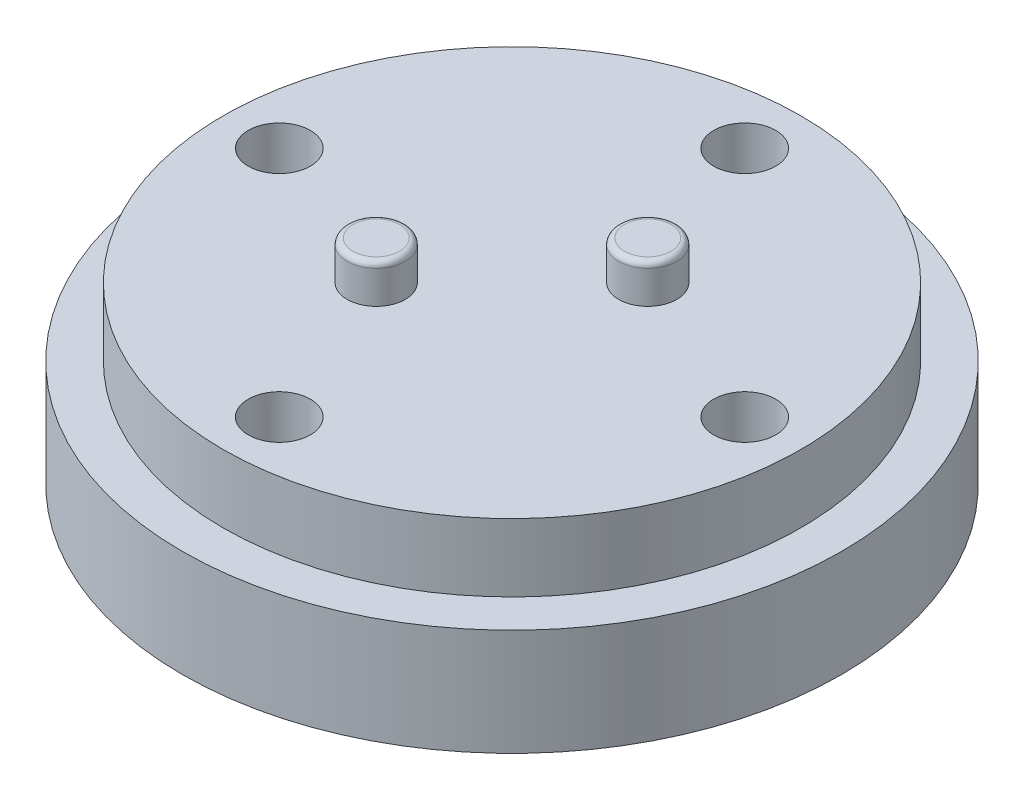
ISO-10303-21;
HEADER;
FILE_DESCRIPTION(('STEP AP214'),'2;1');
FILE_NAME('part.step','',(''),(''),'','','');
FILE_SCHEMA(('AUTOMOTIVE_DESIGN { 1 0 10303 214 1 1 1 1 }'));
ENDSEC;
DATA;
#1=APPLICATION_CONTEXT('core data for automotive mechanical design processes');
#2=APPLICATION_PROTOCOL_DEFINITION('international standard','automotive_design',2000,#1);
#3=PRODUCT_CONTEXT('',#1,'mechanical');
#4=PRODUCT('Part','Part','',(#3));
#5=PRODUCT_RELATED_PRODUCT_CATEGORY('part','',(#4));
#6=PRODUCT_DEFINITION_FORMATION('','',#4);
#7=PRODUCT_DEFINITION_CONTEXT('part definition',#1,'design');
#8=PRODUCT_DEFINITION('design','',#6,#7);
#9=PRODUCT_DEFINITION_SHAPE('','',#8);
#10=(LENGTH_UNIT() NAMED_UNIT(*) SI_UNIT(.MILLI.,.METRE.));
#11=(NAMED_UNIT(*) PLANE_ANGLE_UNIT() SI_UNIT($,.RADIAN.));
#12=(NAMED_UNIT(*) SI_UNIT($,.STERADIAN.) SOLID_ANGLE_UNIT());
#13=UNCERTAINTY_MEASURE_WITH_UNIT(LENGTH_MEASURE(1.E-05),#10,'distance_accuracy_value','');
#14=(GEOMETRIC_REPRESENTATION_CONTEXT(3) GLOBAL_UNCERTAINTY_ASSIGNED_CONTEXT((#13)) GLOBAL_UNIT_ASSIGNED_CONTEXT((#10,
#11,#12)) REPRESENTATION_CONTEXT('',''));
#15=CARTESIAN_POINT('',(0.,0.,0.));
#16=DIRECTION('',(0.,0.,1.));
#17=DIRECTION('',(1.,0.,0.));
#18=AXIS2_PLACEMENT_3D('',#15,#16,#17);
#19=CARTESIAN_POINT('',(0.,-5.5,0.));
#20=DIRECTION('',(0.,-1.,0.));
#21=DIRECTION('',(0.,0.,-1.));
#22=AXIS2_PLACEMENT_3D('',#19,#20,#21);
#23=PLANE('',#22);
#24=CARTESIAN_POINT('',(12.,-5.5,0.));
#25=DIRECTION('',(0.,-1.,0.));
#26=DIRECTION('',(0.,0.,-1.));
#27=AXIS2_PLACEMENT_3D('',#24,#25,#26);
#28=CIRCLE('',#27,1.6);
#29=CARTESIAN_POINT('',(12.,-5.5,-1.6));
#30=VERTEX_POINT('',#29);
#31=EDGE_CURVE('E205',#30,#30,#28,.T.);
#32=ORIENTED_EDGE('',*,*,#31,.F.);
#33=EDGE_LOOP('',(#32));
#34=FACE_BOUND('',#33,.T.);
#35=CARTESIAN_POINT('',(-12.,-5.5,0.));
#36=DIRECTION('',(0.,-1.,0.));
#37=DIRECTION('',(0.,0.,-1.));
#38=AXIS2_PLACEMENT_3D('',#35,#36,#37);
#39=CIRCLE('',#38,1.6);
#40=CARTESIAN_POINT('',(-12.,-5.5,-1.6));
#41=VERTEX_POINT('',#40);
#42=EDGE_CURVE('E213',#41,#41,#39,.T.);
#43=ORIENTED_EDGE('',*,*,#42,.F.);
#44=EDGE_LOOP('',(#43));
#45=FACE_BOUND('',#44,.T.);
#46=CARTESIAN_POINT('',(0.,-5.5,0.));
#47=DIRECTION('',(0.,-1.,0.));
#48=DIRECTION('',(0.,0.,-1.));
#49=AXIS2_PLACEMENT_3D('',#46,#47,#48);
#50=CIRCLE('',#49,17.);
#51=CARTESIAN_POINT('',(0.,-5.5,-17.));
#52=VERTEX_POINT('',#51);
#53=EDGE_CURVE('E218',#52,#52,#50,.T.);
#54=ORIENTED_EDGE('',*,*,#53,.T.);
#55=EDGE_LOOP('',(#54));
#56=FACE_BOUND('',#55,.T.);
#57=CARTESIAN_POINT('',(0.,-5.5,-12.));
#58=DIRECTION('',(0.,-1.,0.));
#59=DIRECTION('',(0.,0.,-1.));
#60=AXIS2_PLACEMENT_3D('',#57,#58,#59);
#61=CIRCLE('',#60,1.6);
#62=CARTESIAN_POINT('',(0.,-5.5,-13.6));
#63=VERTEX_POINT('',#62);
#64=EDGE_CURVE('E209',#63,#63,#61,.T.);
#65=ORIENTED_EDGE('',*,*,#64,.F.);
#66=EDGE_LOOP('',(#65));
#67=FACE_BOUND('',#66,.T.);
#68=CARTESIAN_POINT('',(0.,-5.5,12.));
#69=DIRECTION('',(0.,-1.,0.));
#70=DIRECTION('',(0.,0.,-1.));
#71=AXIS2_PLACEMENT_3D('',#68,#69,#70);
#72=CIRCLE('',#71,1.6);
#73=CARTESIAN_POINT('',(0.,-5.5,10.4));
#74=VERTEX_POINT('',#73);
#75=EDGE_CURVE('E143',#74,#74,#72,.T.);
#76=ORIENTED_EDGE('',*,*,#75,.F.);
#77=EDGE_LOOP('',(#76));
#78=FACE_BOUND('',#77,.T.);
#79=DIRECTION('',(-0.707106781186547,0.,0.707106781186547));
#80=VECTOR('',#79,1.);
#81=CARTESIAN_POINT('',(1.41421356237311,-5.5,4.10121933088196));
#82=LINE('',#81,#80);
#83=CARTESIAN_POINT('',(4.10121933088197,-5.5,1.4142135623731));
#84=VERTEX_POINT('',#83);
#85=CARTESIAN_POINT('',(1.41421356237311,-5.5,4.10121933088196));
#86=VERTEX_POINT('',#85);
#87=EDGE_CURVE('E138',#84,#86,#82,.T.);
#88=ORIENTED_EDGE('',*,*,#87,.F.);
#89=CARTESIAN_POINT('',(2.68700576850888,-5.5,0.));
#90=DIRECTION('',(0.,-1.,0.));
#91=DIRECTION('',(0.,0.,-1.));
#92=AXIS2_PLACEMENT_3D('',#89,#90,#91);
#93=CIRCLE('',#92,2.);
#94=CARTESIAN_POINT('',(4.10121933088197,-5.5,-1.41421356237311));
#95=VERTEX_POINT('',#94);
#96=EDGE_CURVE('E147',#95,#84,#93,.T.);
#97=ORIENTED_EDGE('',*,*,#96,.F.);
#98=DIRECTION('',(0.707106781186548,0.,0.707106781186547));
#99=VECTOR('',#98,1.);
#100=CARTESIAN_POINT('',(1.41421356237311,-5.5,-4.10121933088197));
#101=LINE('',#100,#99);
#102=CARTESIAN_POINT('',(1.41421356237311,-5.5,-4.10121933088197));
#103=VERTEX_POINT('',#102);
#104=EDGE_CURVE('E180',#103,#95,#101,.T.);
#105=ORIENTED_EDGE('',*,*,#104,.F.);
#106=CARTESIAN_POINT('',(0.,-5.5,-2.68700576850888));
#107=DIRECTION('',(0.,-1.,0.));
#108=DIRECTION('',(0.,0.,-1.));
#109=AXIS2_PLACEMENT_3D('',#106,#107,#108);
#110=CIRCLE('',#109,2.);
#111=CARTESIAN_POINT('',(-1.4142135623731,-5.5,-4.10121933088197));
#112=VERTEX_POINT('',#111);
#113=EDGE_CURVE('E176',#112,#103,#110,.T.);
#114=ORIENTED_EDGE('',*,*,#113,.F.);
#115=DIRECTION('',(0.707106781186547,0.,-0.707106781186548));
#116=VECTOR('',#115,1.);
#117=CARTESIAN_POINT('',(-4.10121933088196,-5.5,-1.41421356237311));
#118=LINE('',#117,#116);
#119=CARTESIAN_POINT('',(-4.10121933088196,-5.5,-1.41421356237311));
#120=VERTEX_POINT('',#119);
#121=EDGE_CURVE('E172',#120,#112,#118,.T.);
#122=ORIENTED_EDGE('',*,*,#121,.F.);
#123=CARTESIAN_POINT('',(-2.68700576850888,-5.5,0.));
#124=DIRECTION('',(0.,-1.,0.));
#125=DIRECTION('',(0.,0.,-1.));
#126=AXIS2_PLACEMENT_3D('',#123,#124,#125);
#127=CIRCLE('',#126,2.);
#128=CARTESIAN_POINT('',(-4.10121933088196,-5.5,1.4142135623731));
#129=VERTEX_POINT('',#128);
#130=EDGE_CURVE('E168',#129,#120,#127,.T.);
#131=ORIENTED_EDGE('',*,*,#130,.F.);
#132=DIRECTION('',(-0.707106781186548,0.,-0.707106781186548));
#133=VECTOR('',#132,1.);
#134=CARTESIAN_POINT('',(-4.10121933088196,-5.5,1.4142135623731));
#135=LINE('',#134,#133);
#136=CARTESIAN_POINT('',(-1.4142135623731,-5.5,4.10121933088196));
#137=VERTEX_POINT('',#136);
#138=EDGE_CURVE('E162',#137,#129,#135,.T.);
#139=ORIENTED_EDGE('',*,*,#138,.F.);
#140=CARTESIAN_POINT('',(0.,-5.5,2.68700576850888));
#141=DIRECTION('',(0.,-1.,0.));
#142=DIRECTION('',(0.,0.,1.));
#143=AXIS2_PLACEMENT_3D('',#140,#141,#142);
#144=CIRCLE('',#143,2.);
#145=EDGE_CURVE('E158',#86,#137,#144,.T.);
#146=ORIENTED_EDGE('',*,*,#145,.F.);
#147=EDGE_LOOP('',(#88,#97,#105,#114,#122,#131,#139,#146));
#148=FACE_BOUND('',#147,.T.);
#149=ADVANCED_FACE('F45',(#34,#45,#56,#67,#78,#148),#23,.T.);
#150=CARTESIAN_POINT('',(0.,3.5,12.));
#151=DIRECTION('',(0.,-1.,0.));
#152=DIRECTION('',(0.,0.,-1.));
#153=AXIS2_PLACEMENT_3D('',#150,#151,#152);
#154=CYLINDRICAL_SURFACE('',#153,1.6);
#155=CARTESIAN_POINT('',(0.,3.5,12.));
#156=DIRECTION('',(0.,1.,0.));
#157=DIRECTION('',(0.,0.,1.));
#158=AXIS2_PLACEMENT_3D('',#155,#156,#157);
#159=CIRCLE('',#158,1.6);
#160=CARTESIAN_POINT('',(0.,3.5,13.6));
#161=VERTEX_POINT('',#160);
#162=EDGE_CURVE('E246',#161,#161,#159,.T.);
#163=ORIENTED_EDGE('',*,*,#162,.T.);
#164=EDGE_LOOP('',(#163));
#165=FACE_BOUND('',#164,.T.);
#166=ORIENTED_EDGE('',*,*,#75,.T.);
#167=EDGE_LOOP('',(#166));
#168=FACE_BOUND('',#167,.T.);
#169=ADVANCED_FACE('F406',(#165,#168),#154,.F.);
#170=CARTESIAN_POINT('',(-12.,3.5,0.));
#171=DIRECTION('',(0.,-1.,0.));
#172=DIRECTION('',(0.,0.,-1.));
#173=AXIS2_PLACEMENT_3D('',#170,#171,#172);
#174=CYLINDRICAL_SURFACE('',#173,1.6);
#175=CARTESIAN_POINT('',(-12.,3.5,0.));
#176=DIRECTION('',(0.,1.,0.));
#177=DIRECTION('',(0.,0.,1.));
#178=AXIS2_PLACEMENT_3D('',#175,#176,#177);
#179=CIRCLE('',#178,1.6);
#180=CARTESIAN_POINT('',(-12.,3.5,1.6));
#181=VERTEX_POINT('',#180);
#182=EDGE_CURVE('E242',#181,#181,#179,.T.);
#183=ORIENTED_EDGE('',*,*,#182,.T.);
#184=EDGE_LOOP('',(#183));
#185=FACE_BOUND('',#184,.T.);
#186=ORIENTED_EDGE('',*,*,#42,.T.);
#187=EDGE_LOOP('',(#186));
#188=FACE_BOUND('',#187,.T.);
#189=ADVANCED_FACE('F412',(#185,#188),#174,.F.);
#190=CARTESIAN_POINT('',(0.,3.5,-12.));
#191=DIRECTION('',(0.,-1.,0.));
#192=DIRECTION('',(0.,0.,-1.));
#193=AXIS2_PLACEMENT_3D('',#190,#191,#192);
#194=CYLINDRICAL_SURFACE('',#193,1.6);
#195=CARTESIAN_POINT('',(0.,3.5,-12.));
#196=DIRECTION('',(0.,1.,0.));
#197=DIRECTION('',(0.,0.,1.));
#198=AXIS2_PLACEMENT_3D('',#195,#196,#197);
#199=CIRCLE('',#198,1.6);
#200=CARTESIAN_POINT('',(0.,3.5,-10.4));
#201=VERTEX_POINT('',#200);
#202=EDGE_CURVE('E238',#201,#201,#199,.T.);
#203=ORIENTED_EDGE('',*,*,#202,.T.);
#204=EDGE_LOOP('',(#203));
#205=FACE_BOUND('',#204,.T.);
#206=ORIENTED_EDGE('',*,*,#64,.T.);
#207=EDGE_LOOP('',(#206));
#208=FACE_BOUND('',#207,.T.);
#209=ADVANCED_FACE('F457',(#205,#208),#194,.F.);
#210=CARTESIAN_POINT('',(12.,3.5,0.));
#211=DIRECTION('',(0.,-1.,0.));
#212=DIRECTION('',(0.,0.,-1.));
#213=AXIS2_PLACEMENT_3D('',#210,#211,#212);
#214=CYLINDRICAL_SURFACE('',#213,1.6);
#215=CARTESIAN_POINT('',(12.,3.5,0.));
#216=DIRECTION('',(0.,1.,0.));
#217=DIRECTION('',(0.,0.,1.));
#218=AXIS2_PLACEMENT_3D('',#215,#216,#217);
#219=CIRCLE('',#218,1.6);
#220=CARTESIAN_POINT('',(12.,3.5,1.6));
#221=VERTEX_POINT('',#220);
#222=EDGE_CURVE('E234',#221,#221,#219,.T.);
#223=ORIENTED_EDGE('',*,*,#222,.T.);
#224=EDGE_LOOP('',(#223));
#225=FACE_BOUND('',#224,.T.);
#226=ORIENTED_EDGE('',*,*,#31,.T.);
#227=EDGE_LOOP('',(#226));
#228=FACE_BOUND('',#227,.T.);
#229=ADVANCED_FACE('F452',(#225,#228),#214,.F.);
#230=CARTESIAN_POINT('',(0.,3.5,0.));
#231=DIRECTION('',(0.,-1.,0.));
#232=DIRECTION('',(0.,0.,-1.));
#233=AXIS2_PLACEMENT_3D('',#230,#231,#232);
#234=CYLINDRICAL_SURFACE('',#233,14.9);
#235=CARTESIAN_POINT('',(0.,3.5,0.));
#236=DIRECTION('',(0.,1.,0.));
#237=DIRECTION('',(0.,0.,1.));
#238=AXIS2_PLACEMENT_3D('',#235,#236,#237);
#239=CIRCLE('',#238,14.9);
#240=CARTESIAN_POINT('',(0.,3.5,14.9));
#241=VERTEX_POINT('',#240);
#242=EDGE_CURVE('E250',#241,#241,#239,.T.);
#243=ORIENTED_EDGE('',*,*,#242,.F.);
#244=EDGE_LOOP('',(#243));
#245=FACE_BOUND('',#244,.T.);
#246=CARTESIAN_POINT('',(0.,0.,0.));
#247=DIRECTION('',(0.,1.,0.));
#248=DIRECTION('',(0.,0.,1.));
#249=AXIS2_PLACEMENT_3D('',#246,#247,#248);
#250=CIRCLE('',#249,14.9);
#251=CARTESIAN_POINT('',(0.,0.,14.9));
#252=VERTEX_POINT('',#251);
#253=EDGE_CURVE('E222',#252,#252,#250,.T.);
#254=ORIENTED_EDGE('',*,*,#253,.T.);
#255=EDGE_LOOP('',(#254));
#256=FACE_BOUND('',#255,.T.);
#257=ADVANCED_FACE('F449',(#245,#256),#234,.T.);
#258=CARTESIAN_POINT('',(0.,3.5,0.));
#259=DIRECTION('',(0.,1.,0.));
#260=DIRECTION('',(0.,0.,1.));
#261=AXIS2_PLACEMENT_3D('',#258,#259,#260);
#262=PLANE('',#261);
#263=CARTESIAN_POINT('',(3.5,3.5,-3.5));
#264=DIRECTION('',(0.,1.,0.));
#265=DIRECTION('',(0.,0.,1.));
#266=AXIS2_PLACEMENT_3D('',#263,#264,#265);
#267=CIRCLE('',#266,1.5);
#268=CARTESIAN_POINT('',(3.5,3.5,-2.));
#269=VERTEX_POINT('',#268);
#270=EDGE_CURVE('E226',#269,#269,#267,.T.);
#271=ORIENTED_EDGE('',*,*,#270,.F.);
#272=EDGE_LOOP('',(#271));
#273=FACE_BOUND('',#272,.T.);
#274=CARTESIAN_POINT('',(-3.5,3.5,3.5));
#275=DIRECTION('',(0.,1.,0.));
#276=DIRECTION('',(0.,0.,1.));
#277=AXIS2_PLACEMENT_3D('',#274,#275,#276);
#278=CIRCLE('',#277,1.5);
#279=CARTESIAN_POINT('',(-3.5,3.5,5.));
#280=VERTEX_POINT('',#279);
#281=EDGE_CURVE('E230',#280,#280,#278,.T.);
#282=ORIENTED_EDGE('',*,*,#281,.F.);
#283=EDGE_LOOP('',(#282));
#284=FACE_BOUND('',#283,.T.);
#285=ORIENTED_EDGE('',*,*,#222,.F.);
#286=EDGE_LOOP('',(#285));
#287=FACE_BOUND('',#286,.T.);
#288=ORIENTED_EDGE('',*,*,#202,.F.);
#289=EDGE_LOOP('',(#288));
#290=FACE_BOUND('',#289,.T.);
#291=ORIENTED_EDGE('',*,*,#182,.F.);
#292=EDGE_LOOP('',(#291));
#293=FACE_BOUND('',#292,.T.);
#294=ORIENTED_EDGE('',*,*,#162,.F.);
#295=EDGE_LOOP('',(#294));
#296=FACE_BOUND('',#295,.T.);
#297=ORIENTED_EDGE('',*,*,#242,.T.);
#298=EDGE_LOOP('',(#297));
#299=FACE_BOUND('',#298,.T.);
#300=ADVANCED_FACE('F445',(#273,#284,#287,#290,#293,#296,#299),#262,.T.);
#301=CARTESIAN_POINT('',(-3.5,5.5,3.5));
#302=DIRECTION('',(0.,-1.,0.));
#303=DIRECTION('',(0.,0.,-1.));
#304=AXIS2_PLACEMENT_3D('',#301,#302,#303);
#305=CYLINDRICAL_SURFACE('',#304,1.5);
#306=CARTESIAN_POINT('',(-3.5,5.2,3.5));
#307=DIRECTION('',(0.,1.,0.));
#308=DIRECTION('',(0.,0.,1.));
#309=AXIS2_PLACEMENT_3D('',#306,#307,#308);
#310=CIRCLE('',#309,1.5);
#311=CARTESIAN_POINT('',(-3.5,5.2,5.));
#312=VERTEX_POINT('',#311);
#313=EDGE_CURVE('E269',#312,#312,#310,.F.);
#314=ORIENTED_EDGE('',*,*,#313,.T.);
#315=EDGE_LOOP('',(#314));
#316=FACE_BOUND('',#315,.T.);
#317=ORIENTED_EDGE('',*,*,#281,.T.);
#318=EDGE_LOOP('',(#317));
#319=FACE_BOUND('',#318,.T.);
#320=ADVANCED_FACE('F441',(#316,#319),#305,.T.);
#321=CARTESIAN_POINT('',(-3.5,5.5,3.5));
#322=DIRECTION('',(0.,1.,0.));
#323=DIRECTION('',(0.,0.,1.));
#324=AXIS2_PLACEMENT_3D('',#321,#322,#323);
#325=PLANE('',#324);
#326=CARTESIAN_POINT('',(-3.5,5.5,3.5));
#327=DIRECTION('',(0.,1.,0.));
#328=DIRECTION('',(0.,0.,1.));
#329=AXIS2_PLACEMENT_3D('',#326,#327,#328);
#330=CIRCLE('',#329,1.2);
#331=CARTESIAN_POINT('',(-3.5,5.5,4.7));
#332=VERTEX_POINT('',#331);
#333=EDGE_CURVE('E265',#332,#332,#330,.T.);
#334=ORIENTED_EDGE('',*,*,#333,.T.);
#335=EDGE_LOOP('',(#334));
#336=FACE_BOUND('',#335,.T.);
#337=ADVANCED_FACE('F437',(#336),#325,.T.);
#338=CARTESIAN_POINT('',(3.5,5.5,-3.5));
#339=DIRECTION('',(0.,-1.,0.));
#340=DIRECTION('',(0.,0.,-1.));
#341=AXIS2_PLACEMENT_3D('',#338,#339,#340);
#342=CYLINDRICAL_SURFACE('',#341,1.5);
#343=CARTESIAN_POINT('',(3.5,5.2,-3.5));
#344=DIRECTION('',(0.,1.,0.));
#345=DIRECTION('',(0.,0.,1.));
#346=AXIS2_PLACEMENT_3D('',#343,#344,#345);
#347=CIRCLE('',#346,1.5);
#348=CARTESIAN_POINT('',(3.5,5.2,-2.));
#349=VERTEX_POINT('',#348);
#350=EDGE_CURVE('E261',#349,#349,#347,.F.);
#351=ORIENTED_EDGE('',*,*,#350,.T.);
#352=EDGE_LOOP('',(#351));
#353=FACE_BOUND('',#352,.T.);
#354=ORIENTED_EDGE('',*,*,#270,.T.);
#355=EDGE_LOOP('',(#354));
#356=FACE_BOUND('',#355,.T.);
#357=ADVANCED_FACE('F433',(#353,#356),#342,.T.);
#358=CARTESIAN_POINT('',(3.5,5.5,-3.5));
#359=DIRECTION('',(0.,1.,0.));
#360=DIRECTION('',(0.,0.,1.));
#361=AXIS2_PLACEMENT_3D('',#358,#359,#360);
#362=PLANE('',#361);
#363=CARTESIAN_POINT('',(3.5,5.5,-3.5));
#364=DIRECTION('',(0.,1.,0.));
#365=DIRECTION('',(0.,0.,1.));
#366=AXIS2_PLACEMENT_3D('',#363,#364,#365);
#367=CIRCLE('',#366,1.2);
#368=CARTESIAN_POINT('',(3.5,5.5,-2.3));
#369=VERTEX_POINT('',#368);
#370=EDGE_CURVE('E254',#369,#369,#367,.T.);
#371=ORIENTED_EDGE('',*,*,#370,.T.);
#372=EDGE_LOOP('',(#371));
#373=FACE_BOUND('',#372,.T.);
#374=ADVANCED_FACE('F429',(#373),#362,.T.);
#375=CARTESIAN_POINT('',(3.5,5.2,-3.5));
#376=DIRECTION('',(0.,1.,0.));
#377=DIRECTION('',(0.,0.,1.));
#378=AXIS2_PLACEMENT_3D('',#375,#376,#377);
#379=TOROIDAL_SURFACE('',#378,1.2,0.3);
#380=ORIENTED_EDGE('',*,*,#350,.F.);
#381=EDGE_LOOP('',(#380));
#382=FACE_BOUND('',#381,.T.);
#383=ORIENTED_EDGE('',*,*,#370,.F.);
#384=EDGE_LOOP('',(#383));
#385=FACE_BOUND('',#384,.T.);
#386=ADVANCED_FACE('F432',(#382,#385),#379,.T.);
#387=CARTESIAN_POINT('',(-3.5,5.2,3.5));
#388=DIRECTION('',(0.,1.,0.));
#389=DIRECTION('',(0.,0.,1.));
#390=AXIS2_PLACEMENT_3D('',#387,#388,#389);
#391=TOROIDAL_SURFACE('',#390,1.2,0.3);
#392=ORIENTED_EDGE('',*,*,#313,.F.);
#393=EDGE_LOOP('',(#392));
#394=FACE_BOUND('',#393,.T.);
#395=ORIENTED_EDGE('',*,*,#333,.F.);
#396=EDGE_LOOP('',(#395));
#397=FACE_BOUND('',#396,.T.);
#398=ADVANCED_FACE('F424',(#394,#397),#391,.T.);
#399=CARTESIAN_POINT('',(0.,0.,0.));
#400=DIRECTION('',(0.,-1.,0.));
#401=DIRECTION('',(0.,0.,-1.));
#402=AXIS2_PLACEMENT_3D('',#399,#400,#401);
#403=PLANE('',#402);
#404=ORIENTED_EDGE('',*,*,#253,.F.);
#405=EDGE_LOOP('',(#404));
#406=FACE_BOUND('',#405,.T.);
#407=CARTESIAN_POINT('',(0.,0.,0.));
#408=DIRECTION('',(0.,-1.,0.));
#409=DIRECTION('',(0.,0.,-1.));
#410=AXIS2_PLACEMENT_3D('',#407,#408,#409);
#411=CIRCLE('',#410,17.);
#412=CARTESIAN_POINT('',(0.,0.,-17.));
#413=VERTEX_POINT('',#412);
#414=EDGE_CURVE('E217',#413,#413,#411,.T.);
#415=ORIENTED_EDGE('',*,*,#414,.F.);
#416=EDGE_LOOP('',(#415));
#417=FACE_BOUND('',#416,.T.);
#418=ADVANCED_FACE('F420',(#406,#417),#403,.F.);
#419=CARTESIAN_POINT('',(0.,-5.5,0.));
#420=DIRECTION('',(0.,1.,0.));
#421=DIRECTION('',(0.,0.,1.));
#422=AXIS2_PLACEMENT_3D('',#419,#420,#421);
#423=CYLINDRICAL_SURFACE('',#422,17.);
#424=ORIENTED_EDGE('',*,*,#53,.F.);
#425=EDGE_LOOP('',(#424));
#426=FACE_BOUND('',#425,.T.);
#427=ORIENTED_EDGE('',*,*,#414,.T.);
#428=EDGE_LOOP('',(#427));
#429=FACE_BOUND('',#428,.T.);
#430=ADVANCED_FACE('F423',(#426,#429),#423,.T.);
#431=CARTESIAN_POINT('',(2.68700576850888,-8.5,0.));
#432=DIRECTION('',(0.,1.,0.));
#433=DIRECTION('',(0.,0.,1.));
#434=AXIS2_PLACEMENT_3D('',#431,#432,#433);
#435=CYLINDRICAL_SURFACE('',#434,2.);
#436=DIRECTION('',(0.,1.,0.));
#437=VECTOR('',#436,1.);
#438=CARTESIAN_POINT('',(4.10121933088197,-8.5,1.4142135623731));
#439=LINE('',#438,#437);
#440=CARTESIAN_POINT('',(4.10121933088197,-8.,1.4142135623731));
#441=VERTEX_POINT('',#440);
#442=EDGE_CURVE('E134',#441,#84,#439,.T.);
#443=ORIENTED_EDGE('',*,*,#442,.F.);
#444=CARTESIAN_POINT('',(2.68700576850888,-8.,0.));
#445=DIRECTION('',(0.,-1.,0.));
#446=DIRECTION('',(0.,0.,-1.));
#447=AXIS2_PLACEMENT_3D('',#444,#445,#446);
#448=CIRCLE('',#447,2.);
#449=CARTESIAN_POINT('',(4.10121933088197,-8.,-1.41421356237311));
#450=VERTEX_POINT('',#449);
#451=EDGE_CURVE('E11',#441,#450,#448,.F.);
#452=ORIENTED_EDGE('',*,*,#451,.T.);
#453=DIRECTION('',(0.,1.,0.));
#454=VECTOR('',#453,1.);
#455=CARTESIAN_POINT('',(4.10121933088197,-8.5,-1.41421356237311));
#456=LINE('',#455,#454);
#457=EDGE_CURVE('E150',#450,#95,#456,.T.);
#458=ORIENTED_EDGE('',*,*,#457,.T.);
#459=ORIENTED_EDGE('',*,*,#96,.T.);
#460=EDGE_LOOP('',(#443,#452,#458,#459));
#461=FACE_BOUND('',#460,.T.);
#462=ADVANCED_FACE('F148',(#461),#435,.T.);
#463=CARTESIAN_POINT('',(1.41421356237311,-8.5,4.10121933088196));
#464=DIRECTION('',(-0.707106781186548,0.,-0.707106781186548));
#465=DIRECTION('',(-0.707106781186548,0.,0.707106781186548));
#466=AXIS2_PLACEMENT_3D('',#463,#464,#465);
#467=PLANE('',#466);
#468=DIRECTION('',(0.,1.,0.));
#469=VECTOR('',#468,1.);
#470=CARTESIAN_POINT('',(1.41421356237311,-8.5,4.10121933088196));
#471=LINE('',#470,#469);
#472=CARTESIAN_POINT('',(1.41421356237311,-8.,4.10121933088196));
#473=VERTEX_POINT('',#472);
#474=EDGE_CURVE('E144',#473,#86,#471,.T.);
#475=ORIENTED_EDGE('',*,*,#474,.F.);
#476=DIRECTION('',(-0.707106781186548,0.,0.707106781186548));
#477=VECTOR('',#476,1.);
#478=CARTESIAN_POINT('',(4.10121933088197,-8.,1.4142135623731));
#479=LINE('',#478,#477);
#480=EDGE_CURVE('E55',#473,#441,#479,.F.);
#481=ORIENTED_EDGE('',*,*,#480,.T.);
#482=ORIENTED_EDGE('',*,*,#442,.T.);
#483=ORIENTED_EDGE('',*,*,#87,.T.);
#484=EDGE_LOOP('',(#475,#481,#482,#483));
#485=FACE_BOUND('',#484,.T.);
#486=ADVANCED_FACE('F136',(#485),#467,.F.);
#487=CARTESIAN_POINT('',(0.,-8.5,2.68700576850888));
#488=DIRECTION('',(0.,1.,0.));
#489=DIRECTION('',(0.,0.,1.));
#490=AXIS2_PLACEMENT_3D('',#487,#488,#489);
#491=CYLINDRICAL_SURFACE('',#490,2.);
#492=DIRECTION('',(0.,1.,0.));
#493=VECTOR('',#492,1.);
#494=CARTESIAN_POINT('',(-1.4142135623731,-8.5,4.10121933088196));
#495=LINE('',#494,#493);
#496=CARTESIAN_POINT('',(-1.4142135623731,-8.,4.10121933088196));
#497=VERTEX_POINT('',#496);
#498=EDGE_CURVE('E197',#497,#137,#495,.T.);
#499=ORIENTED_EDGE('',*,*,#498,.F.);
#500=CARTESIAN_POINT('',(0.,-8.,2.68700576850888));
#501=DIRECTION('',(0.,-1.,0.));
#502=DIRECTION('',(0.,0.,-1.));
#503=AXIS2_PLACEMENT_3D('',#500,#501,#502);
#504=CIRCLE('',#503,2.);
#505=EDGE_CURVE('E70',#497,#473,#504,.F.);
#506=ORIENTED_EDGE('',*,*,#505,.T.);
#507=ORIENTED_EDGE('',*,*,#474,.T.);
#508=ORIENTED_EDGE('',*,*,#145,.T.);
#509=EDGE_LOOP('',(#499,#506,#507,#508));
#510=FACE_BOUND('',#509,.T.);
#511=ADVANCED_FACE('F359',(#510),#491,.T.);
#512=CARTESIAN_POINT('',(-4.10121933088196,-8.5,1.4142135623731));
#513=DIRECTION('',(0.707106781186547,0.,-0.707106781186547));
#514=DIRECTION('',(-0.707106781186548,0.,-0.707106781186548));
#515=AXIS2_PLACEMENT_3D('',#512,#513,#514);
#516=PLANE('',#515);
#517=DIRECTION('',(0.,1.,0.));
#518=VECTOR('',#517,1.);
#519=CARTESIAN_POINT('',(-4.10121933088196,-8.5,1.4142135623731));
#520=LINE('',#519,#518);
#521=CARTESIAN_POINT('',(-4.10121933088196,-8.,1.4142135623731));
#522=VERTEX_POINT('',#521);
#523=EDGE_CURVE('E194',#522,#129,#520,.T.);
#524=ORIENTED_EDGE('',*,*,#523,.F.);
#525=DIRECTION('',(-0.707106781186548,0.,-0.707106781186548));
#526=VECTOR('',#525,1.);
#527=CARTESIAN_POINT('',(-1.4142135623731,-8.,4.10121933088196));
#528=LINE('',#527,#526);
#529=EDGE_CURVE('E311',#522,#497,#528,.F.);
#530=ORIENTED_EDGE('',*,*,#529,.T.);
#531=ORIENTED_EDGE('',*,*,#498,.T.);
#532=ORIENTED_EDGE('',*,*,#138,.T.);
#533=EDGE_LOOP('',(#524,#530,#531,#532));
#534=FACE_BOUND('',#533,.T.);
#535=ADVANCED_FACE('F358',(#534),#516,.F.);
#536=CARTESIAN_POINT('',(-2.68700576850888,-8.5,0.));
#537=DIRECTION('',(0.,1.,0.));
#538=DIRECTION('',(0.,0.,1.));
#539=AXIS2_PLACEMENT_3D('',#536,#537,#538);
#540=CYLINDRICAL_SURFACE('',#539,2.);
#541=DIRECTION('',(0.,1.,0.));
#542=VECTOR('',#541,1.);
#543=CARTESIAN_POINT('',(-4.10121933088196,-8.5,-1.41421356237311));
#544=LINE('',#543,#542);
#545=CARTESIAN_POINT('',(-4.10121933088196,-8.,-1.41421356237311));
#546=VERTEX_POINT('',#545);
#547=EDGE_CURVE('E191',#546,#120,#544,.T.);
#548=ORIENTED_EDGE('',*,*,#547,.F.);
#549=CARTESIAN_POINT('',(-2.68700576850888,-8.,0.));
#550=DIRECTION('',(0.,-1.,0.));
#551=DIRECTION('',(0.,0.,-1.));
#552=AXIS2_PLACEMENT_3D('',#549,#550,#551);
#553=CIRCLE('',#552,2.);
#554=EDGE_CURVE('E308',#546,#522,#553,.F.);
#555=ORIENTED_EDGE('',*,*,#554,.T.);
#556=ORIENTED_EDGE('',*,*,#523,.T.);
#557=ORIENTED_EDGE('',*,*,#130,.T.);
#558=EDGE_LOOP('',(#548,#555,#556,#557));
#559=FACE_BOUND('',#558,.T.);
#560=ADVANCED_FACE('F365',(#559),#540,.T.);
#561=CARTESIAN_POINT('',(-4.10121933088196,-8.5,-1.41421356237311));
#562=DIRECTION('',(0.707106781186548,0.,0.707106781186547));
#563=DIRECTION('',(0.707106781186547,0.,-0.707106781186548));
#564=AXIS2_PLACEMENT_3D('',#561,#562,#563);
#565=PLANE('',#564);
#566=DIRECTION('',(0.,1.,0.));
#567=VECTOR('',#566,1.);
#568=CARTESIAN_POINT('',(-1.4142135623731,-8.5,-4.10121933088197));
#569=LINE('',#568,#567);
#570=CARTESIAN_POINT('',(-1.4142135623731,-8.,-4.10121933088197));
#571=VERTEX_POINT('',#570);
#572=EDGE_CURVE('E188',#571,#112,#569,.T.);
#573=ORIENTED_EDGE('',*,*,#572,.F.);
#574=DIRECTION('',(0.707106781186547,0.,-0.707106781186548));
#575=VECTOR('',#574,1.);
#576=CARTESIAN_POINT('',(-4.10121933088197,-8.,-1.4142135623731));
#577=LINE('',#576,#575);
#578=EDGE_CURVE('E305',#571,#546,#577,.F.);
#579=ORIENTED_EDGE('',*,*,#578,.T.);
#580=ORIENTED_EDGE('',*,*,#547,.T.);
#581=ORIENTED_EDGE('',*,*,#121,.T.);
#582=EDGE_LOOP('',(#573,#579,#580,#581));
#583=FACE_BOUND('',#582,.T.);
#584=ADVANCED_FACE('F368',(#583),#565,.F.);
#585=CARTESIAN_POINT('',(0.,-8.5,-2.68700576850888));
#586=DIRECTION('',(0.,1.,0.));
#587=DIRECTION('',(0.,0.,1.));
#588=AXIS2_PLACEMENT_3D('',#585,#586,#587);
#589=CYLINDRICAL_SURFACE('',#588,2.);
#590=DIRECTION('',(0.,1.,0.));
#591=VECTOR('',#590,1.);
#592=CARTESIAN_POINT('',(1.41421356237311,-8.5,-4.10121933088197));
#593=LINE('',#592,#591);
#594=CARTESIAN_POINT('',(1.41421356237311,-8.,-4.10121933088197));
#595=VERTEX_POINT('',#594);
#596=EDGE_CURVE('E185',#595,#103,#593,.T.);
#597=ORIENTED_EDGE('',*,*,#596,.F.);
#598=CARTESIAN_POINT('',(0.,-8.,-2.68700576850888));
#599=DIRECTION('',(0.,-1.,0.));
#600=DIRECTION('',(0.,0.,-1.));
#601=AXIS2_PLACEMENT_3D('',#598,#599,#600);
#602=CIRCLE('',#601,2.);
#603=EDGE_CURVE('E302',#595,#571,#602,.F.);
#604=ORIENTED_EDGE('',*,*,#603,.T.);
#605=ORIENTED_EDGE('',*,*,#572,.T.);
#606=ORIENTED_EDGE('',*,*,#113,.T.);
#607=EDGE_LOOP('',(#597,#604,#605,#606));
#608=FACE_BOUND('',#607,.T.);
#609=ADVANCED_FACE('F549',(#608),#589,.T.);
#610=CARTESIAN_POINT('',(1.41421356237311,-8.5,-4.10121933088197));
#611=DIRECTION('',(-0.707106781186547,0.,0.707106781186548));
#612=DIRECTION('',(0.707106781186548,0.,0.707106781186547));
#613=AXIS2_PLACEMENT_3D('',#610,#611,#612);
#614=PLANE('',#613);
#615=ORIENTED_EDGE('',*,*,#457,.F.);
#616=DIRECTION('',(0.707106781186548,0.,0.707106781186547));
#617=VECTOR('',#616,1.);
#618=CARTESIAN_POINT('',(1.4142135623731,-8.,-4.10121933088197));
#619=LINE('',#618,#617);
#620=EDGE_CURVE('E298',#450,#595,#619,.F.);
#621=ORIENTED_EDGE('',*,*,#620,.T.);
#622=ORIENTED_EDGE('',*,*,#596,.T.);
#623=ORIENTED_EDGE('',*,*,#104,.T.);
#624=EDGE_LOOP('',(#615,#621,#622,#623));
#625=FACE_BOUND('',#624,.T.);
#626=ADVANCED_FACE('F394',(#625),#614,.F.);
#627=CARTESIAN_POINT('',(2.68700576850888,-8.5,0.));
#628=DIRECTION('',(0.,-1.,0.));
#629=DIRECTION('',(0.,0.,-1.));
#630=AXIS2_PLACEMENT_3D('',#627,#628,#629);
#631=PLANE('',#630);
#632=CARTESIAN_POINT('',(0.,-8.5,-2.68700576850888));
#633=DIRECTION('',(0.,-1.,0.));
#634=DIRECTION('',(0.,0.,-1.));
#635=AXIS2_PLACEMENT_3D('',#632,#633,#634);
#636=CIRCLE('',#635,1.5);
#637=CARTESIAN_POINT('',(-1.06066017177983,-8.5,-3.7476659402887));
#638=VERTEX_POINT('',#637);
#639=CARTESIAN_POINT('',(1.06066017177983,-8.5,-3.74766594028869));
#640=VERTEX_POINT('',#639);
#641=EDGE_CURVE('E291',#638,#640,#636,.T.);
#642=ORIENTED_EDGE('',*,*,#641,.T.);
#643=DIRECTION('',(0.707106781186548,0.,0.707106781186547));
#644=VECTOR('',#643,1.);
#645=CARTESIAN_POINT('',(3.74766594028869,-8.5,-1.06066017177983));
#646=LINE('',#645,#644);
#647=CARTESIAN_POINT('',(3.74766594028869,-8.5,-1.06066017177983));
#648=VERTEX_POINT('',#647);
#649=EDGE_CURVE('E294',#640,#648,#646,.T.);
#650=ORIENTED_EDGE('',*,*,#649,.T.);
#651=CARTESIAN_POINT('',(2.68700576850888,-8.5,0.));
#652=DIRECTION('',(0.,-1.,0.));
#653=DIRECTION('',(0.,0.,-1.));
#654=AXIS2_PLACEMENT_3D('',#651,#652,#653);
#655=CIRCLE('',#654,1.5);
#656=CARTESIAN_POINT('',(3.74766594028869,-8.5,1.06066017177983));
#657=VERTEX_POINT('',#656);
#658=EDGE_CURVE('E273',#648,#657,#655,.T.);
#659=ORIENTED_EDGE('',*,*,#658,.T.);
#660=DIRECTION('',(-0.707106781186548,0.,0.707106781186548));
#661=VECTOR('',#660,1.);
#662=CARTESIAN_POINT('',(1.06066017177983,-8.5,3.74766594028869));
#663=LINE('',#662,#661);
#664=CARTESIAN_POINT('',(1.06066017177983,-8.5,3.74766594028869));
#665=VERTEX_POINT('',#664);
#666=EDGE_CURVE('E276',#657,#665,#663,.T.);
#667=ORIENTED_EDGE('',*,*,#666,.T.);
#668=CARTESIAN_POINT('',(0.,-8.5,2.68700576850888));
#669=DIRECTION('',(0.,-1.,0.));
#670=DIRECTION('',(0.,0.,-1.));
#671=AXIS2_PLACEMENT_3D('',#668,#669,#670);
#672=CIRCLE('',#671,1.5);
#673=CARTESIAN_POINT('',(-1.06066017177983,-8.5,3.74766594028869));
#674=VERTEX_POINT('',#673);
#675=EDGE_CURVE('E279',#665,#674,#672,.T.);
#676=ORIENTED_EDGE('',*,*,#675,.T.);
#677=DIRECTION('',(-0.707106781186548,0.,-0.707106781186548));
#678=VECTOR('',#677,1.);
#679=CARTESIAN_POINT('',(-3.74766594028869,-8.5,1.06066017177983));
#680=LINE('',#679,#678);
#681=CARTESIAN_POINT('',(-3.74766594028869,-8.5,1.06066017177983));
#682=VERTEX_POINT('',#681);
#683=EDGE_CURVE('E282',#674,#682,#680,.T.);
#684=ORIENTED_EDGE('',*,*,#683,.T.);
#685=CARTESIAN_POINT('',(-2.68700576850888,-8.5,0.));
#686=DIRECTION('',(0.,-1.,0.));
#687=DIRECTION('',(0.,0.,-1.));
#688=AXIS2_PLACEMENT_3D('',#685,#686,#687);
#689=CIRCLE('',#688,1.5);
#690=CARTESIAN_POINT('',(-3.74766594028869,-8.5,-1.06066017177983));
#691=VERTEX_POINT('',#690);
#692=EDGE_CURVE('E285',#682,#691,#689,.T.);
#693=ORIENTED_EDGE('',*,*,#692,.T.);
#694=DIRECTION('',(0.707106781186547,0.,-0.707106781186548));
#695=VECTOR('',#694,1.);
#696=CARTESIAN_POINT('',(-1.06066017177983,-8.5,-3.74766594028869));
#697=LINE('',#696,#695);
#698=EDGE_CURVE('E288',#691,#638,#697,.T.);
#699=ORIENTED_EDGE('',*,*,#698,.T.);
#700=EDGE_LOOP('',(#642,#650,#659,#667,#676,#684,#693,#699));
#701=FACE_BOUND('',#700,.T.);
#702=ADVANCED_FACE('F381',(#701),#631,.T.);
#703=CARTESIAN_POINT('',(-1.06066017177982,-8.,3.7476659402887));
#704=DIRECTION('',(0.707106781186548,0.,0.707106781186548));
#705=DIRECTION('',(0.707106781186548,0.,-0.707106781186548));
#706=AXIS2_PLACEMENT_3D('',#703,#704,#705);
#707=CYLINDRICAL_SURFACE('',#706,0.5);
#708=CARTESIAN_POINT('',(-1.06066017177983,-8.,3.74766594028869));
#709=DIRECTION('',(0.707106781186547,0.,0.707106781186547));
#710=DIRECTION('',(0.707106781186548,0.,-0.707106781186548));
#711=AXIS2_PLACEMENT_3D('',#708,#709,#710);
#712=CIRCLE('',#711,0.5);
#713=EDGE_CURVE('E339',#497,#674,#712,.T.);
#714=ORIENTED_EDGE('',*,*,#713,.F.);
#715=ORIENTED_EDGE('',*,*,#529,.F.);
#716=CARTESIAN_POINT('',(-3.74766594028869,-8.,1.06066017177983));
#717=DIRECTION('',(-0.707106781186553,0.,-0.707106781186542));
#718=DIRECTION('',(-0.707106781186542,0.,0.707106781186553));
#719=AXIS2_PLACEMENT_3D('',#716,#717,#718);
#720=CIRCLE('',#719,0.5);
#721=EDGE_CURVE('E49',#682,#522,#720,.T.);
#722=ORIENTED_EDGE('',*,*,#721,.F.);
#723=ORIENTED_EDGE('',*,*,#683,.F.);
#724=EDGE_LOOP('',(#714,#715,#722,#723));
#725=FACE_BOUND('',#724,.T.);
#726=ADVANCED_FACE('F47',(#725),#707,.T.);
#727=CARTESIAN_POINT('',(-2.68700576850888,-8.,0.));
#728=DIRECTION('',(0.,-1.,0.));
#729=DIRECTION('',(0.,0.,-1.));
#730=AXIS2_PLACEMENT_3D('',#727,#728,#729);
#731=TOROIDAL_SURFACE('',#730,1.5,0.5);
#732=ORIENTED_EDGE('',*,*,#721,.T.);
#733=ORIENTED_EDGE('',*,*,#554,.F.);
#734=CARTESIAN_POINT('',(-3.74766594028869,-8.,-1.06066017177983));
#735=DIRECTION('',(0.707106781186547,0.,-0.707106781186547));
#736=DIRECTION('',(-0.707106781186548,0.,-0.707106781186548));
#737=AXIS2_PLACEMENT_3D('',#734,#735,#736);
#738=CIRCLE('',#737,0.5);
#739=EDGE_CURVE('E336',#691,#546,#738,.T.);
#740=ORIENTED_EDGE('',*,*,#739,.F.);
#741=ORIENTED_EDGE('',*,*,#692,.F.);
#742=EDGE_LOOP('',(#732,#733,#740,#741));
#743=FACE_BOUND('',#742,.T.);
#744=ADVANCED_FACE('F351',(#743),#731,.T.);
#745=CARTESIAN_POINT('',(0.,-8.,2.68700576850888));
#746=DIRECTION('',(0.,-1.,0.));
#747=DIRECTION('',(0.,0.,-1.));
#748=AXIS2_PLACEMENT_3D('',#745,#746,#747);
#749=TOROIDAL_SURFACE('',#748,1.5,0.5);
#750=ORIENTED_EDGE('',*,*,#713,.T.);
#751=ORIENTED_EDGE('',*,*,#675,.F.);
#752=CARTESIAN_POINT('',(1.06066017177983,-8.,3.74766594028869));
#753=DIRECTION('',(0.707106781186542,0.,-0.707106781186553));
#754=DIRECTION('',(-0.707106781186553,0.,-0.707106781186542));
#755=AXIS2_PLACEMENT_3D('',#752,#753,#754);
#756=CIRCLE('',#755,0.5);
#757=EDGE_CURVE('E332',#473,#665,#756,.T.);
#758=ORIENTED_EDGE('',*,*,#757,.F.);
#759=ORIENTED_EDGE('',*,*,#505,.F.);
#760=EDGE_LOOP('',(#750,#751,#758,#759));
#761=FACE_BOUND('',#760,.T.);
#762=ADVANCED_FACE('F384',(#761),#749,.T.);
#763=CARTESIAN_POINT('',(-1.06066017177982,-8.,-3.7476659402887));
#764=DIRECTION('',(-0.707106781186547,0.,0.707106781186548));
#765=DIRECTION('',(0.707106781186548,0.,0.707106781186547));
#766=AXIS2_PLACEMENT_3D('',#763,#764,#765);
#767=CYLINDRICAL_SURFACE('',#766,0.5);
#768=ORIENTED_EDGE('',*,*,#739,.T.);
#769=ORIENTED_EDGE('',*,*,#578,.F.);
#770=CARTESIAN_POINT('',(-1.06066017177983,-8.,-3.7476659402887));
#771=DIRECTION('',(0.707106781186542,0.,-0.707106781186553));
#772=DIRECTION('',(-0.707106781186553,0.,-0.707106781186542));
#773=AXIS2_PLACEMENT_3D('',#770,#771,#772);
#774=CIRCLE('',#773,0.5);
#775=EDGE_CURVE('E328',#638,#571,#774,.T.);
#776=ORIENTED_EDGE('',*,*,#775,.F.);
#777=ORIENTED_EDGE('',*,*,#698,.F.);
#778=EDGE_LOOP('',(#768,#769,#776,#777));
#779=FACE_BOUND('',#778,.T.);
#780=ADVANCED_FACE('F372',(#779),#767,.T.);
#781=CARTESIAN_POINT('',(3.7476659402887,-8.,1.06066017177982));
#782=DIRECTION('',(0.707106781186548,0.,-0.707106781186548));
#783=DIRECTION('',(-0.707106781186548,0.,-0.707106781186548));
#784=AXIS2_PLACEMENT_3D('',#781,#782,#783);
#785=CYLINDRICAL_SURFACE('',#784,0.5);
#786=ORIENTED_EDGE('',*,*,#757,.T.);
#787=ORIENTED_EDGE('',*,*,#666,.F.);
#788=CARTESIAN_POINT('',(3.74766594028869,-8.,1.06066017177983));
#789=DIRECTION('',(0.707106781186547,0.,-0.707106781186547));
#790=DIRECTION('',(-0.707106781186548,0.,-0.707106781186548));
#791=AXIS2_PLACEMENT_3D('',#788,#789,#790);
#792=CIRCLE('',#791,0.5);
#793=EDGE_CURVE('E324',#441,#657,#792,.T.);
#794=ORIENTED_EDGE('',*,*,#793,.F.);
#795=ORIENTED_EDGE('',*,*,#480,.F.);
#796=EDGE_LOOP('',(#786,#787,#794,#795));
#797=FACE_BOUND('',#796,.T.);
#798=ADVANCED_FACE('F386',(#797),#785,.T.);
#799=CARTESIAN_POINT('',(0.,-8.,-2.68700576850888));
#800=DIRECTION('',(0.,-1.,0.));
#801=DIRECTION('',(0.,0.,-1.));
#802=AXIS2_PLACEMENT_3D('',#799,#800,#801);
#803=TOROIDAL_SURFACE('',#802,1.5,0.5);
#804=ORIENTED_EDGE('',*,*,#775,.T.);
#805=ORIENTED_EDGE('',*,*,#603,.F.);
#806=CARTESIAN_POINT('',(1.06066017177983,-8.,-3.74766594028869));
#807=DIRECTION('',(0.707106781186547,0.,0.707106781186548));
#808=DIRECTION('',(0.707106781186548,0.,-0.707106781186547));
#809=AXIS2_PLACEMENT_3D('',#806,#807,#808);
#810=CIRCLE('',#809,0.5);
#811=EDGE_CURVE('E321',#640,#595,#810,.T.);
#812=ORIENTED_EDGE('',*,*,#811,.F.);
#813=ORIENTED_EDGE('',*,*,#641,.F.);
#814=EDGE_LOOP('',(#804,#805,#812,#813));
#815=FACE_BOUND('',#814,.T.);
#816=ADVANCED_FACE('F377',(#815),#803,.T.);
#817=CARTESIAN_POINT('',(2.68700576850888,-8.,0.));
#818=DIRECTION('',(0.,-1.,0.));
#819=DIRECTION('',(0.,0.,-1.));
#820=AXIS2_PLACEMENT_3D('',#817,#818,#819);
#821=TOROIDAL_SURFACE('',#820,1.5,0.5);
#822=ORIENTED_EDGE('',*,*,#793,.T.);
#823=ORIENTED_EDGE('',*,*,#658,.F.);
#824=CARTESIAN_POINT('',(3.7476659402887,-8.,-1.06066017177983));
#825=DIRECTION('',(-0.707106781186553,0.,-0.707106781186542));
#826=DIRECTION('',(-0.707106781186542,0.,0.707106781186553));
#827=AXIS2_PLACEMENT_3D('',#824,#825,#826);
#828=CIRCLE('',#827,0.5);
#829=EDGE_CURVE('E318',#450,#648,#828,.T.);
#830=ORIENTED_EDGE('',*,*,#829,.F.);
#831=ORIENTED_EDGE('',*,*,#451,.F.);
#832=EDGE_LOOP('',(#822,#823,#830,#831));
#833=FACE_BOUND('',#832,.T.);
#834=ADVANCED_FACE('F391',(#833),#821,.T.);
#835=CARTESIAN_POINT('',(3.7476659402887,-8.,-1.06066017177982));
#836=DIRECTION('',(-0.707106781186548,0.,-0.707106781186547));
#837=DIRECTION('',(-0.707106781186547,0.,0.707106781186548));
#838=AXIS2_PLACEMENT_3D('',#835,#836,#837);
#839=CYLINDRICAL_SURFACE('',#838,0.5);
#840=ORIENTED_EDGE('',*,*,#811,.T.);
#841=ORIENTED_EDGE('',*,*,#620,.F.);
#842=ORIENTED_EDGE('',*,*,#829,.T.);
#843=ORIENTED_EDGE('',*,*,#649,.F.);
#844=EDGE_LOOP('',(#840,#841,#842,#843));
#845=FACE_BOUND('',#844,.T.);
#846=ADVANCED_FACE('F397',(#845),#839,.T.);
#847=CLOSED_SHELL('',(#149,#169,#189,#209,#229,#257,#300,#320,#337,#357,#374,#386,#398,#418,
#430,#462,#486,#511,#535,#560,#584,#609,#626,#702,#726,#744,#762,#780,#798,#816,#834,#846));
#848=MANIFOLD_SOLID_BREP('B2',#847);
#849=ADVANCED_BREP_SHAPE_REPRESENTATION('',(#18,#848),#14);
#850=SHAPE_DEFINITION_REPRESENTATION(#9,#849);
ENDSEC;
END-ISO-10303-21;
